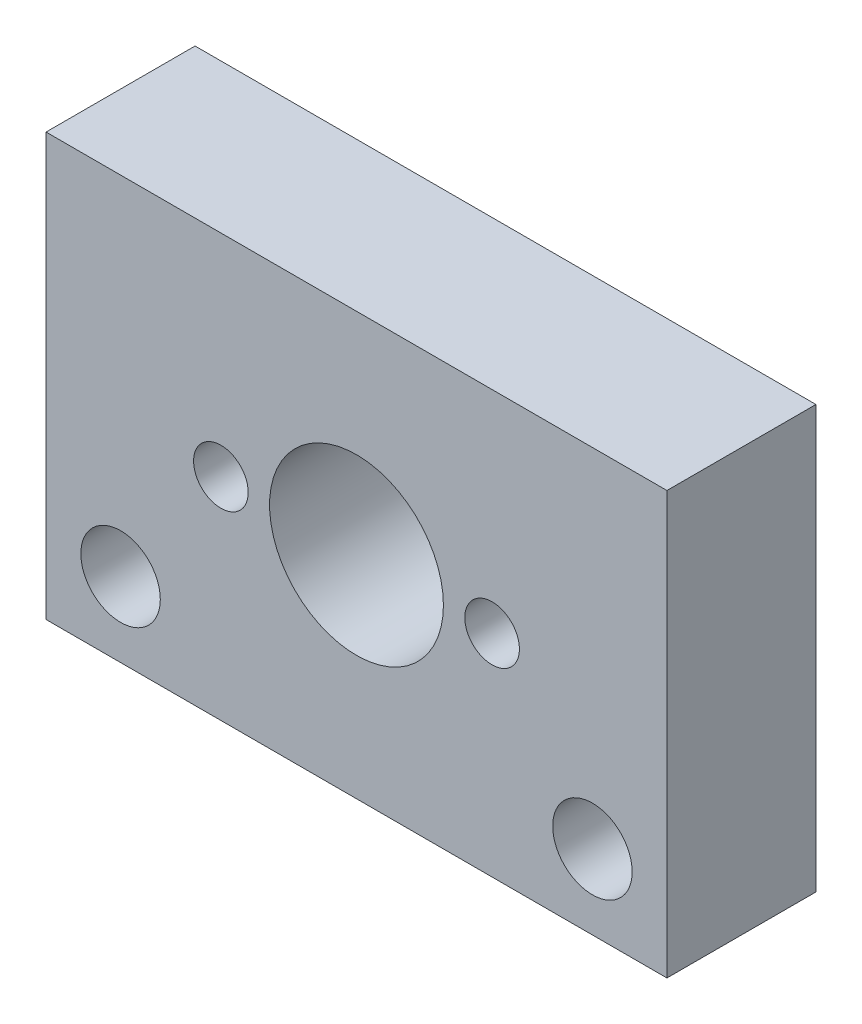
ISO-10303-21;
HEADER;
FILE_DESCRIPTION(('STEP AP214'),'2;1');
FILE_NAME('part.step','',(''),(''),'','','');
FILE_SCHEMA(('AUTOMOTIVE_DESIGN { 1 0 10303 214 1 1 1 1 }'));
ENDSEC;
DATA;
#1=APPLICATION_CONTEXT('core data for automotive mechanical design processes');
#2=APPLICATION_PROTOCOL_DEFINITION('international standard','automotive_design',2000,#1);
#3=PRODUCT_CONTEXT('',#1,'mechanical');
#4=PRODUCT('Part','Part','',(#3));
#5=PRODUCT_RELATED_PRODUCT_CATEGORY('part','',(#4));
#6=PRODUCT_DEFINITION_FORMATION('','',#4);
#7=PRODUCT_DEFINITION_CONTEXT('part definition',#1,'design');
#8=PRODUCT_DEFINITION('design','',#6,#7);
#9=PRODUCT_DEFINITION_SHAPE('','',#8);
#10=(LENGTH_UNIT() NAMED_UNIT(*) SI_UNIT(.MILLI.,.METRE.));
#11=(NAMED_UNIT(*) PLANE_ANGLE_UNIT() SI_UNIT($,.RADIAN.));
#12=(NAMED_UNIT(*) SI_UNIT($,.STERADIAN.) SOLID_ANGLE_UNIT());
#13=UNCERTAINTY_MEASURE_WITH_UNIT(LENGTH_MEASURE(1.E-05),#10,'distance_accuracy_value','');
#14=(GEOMETRIC_REPRESENTATION_CONTEXT(3) GLOBAL_UNCERTAINTY_ASSIGNED_CONTEXT((#13)) GLOBAL_UNIT_ASSIGNED_CONTEXT((#10,
#11,#12)) REPRESENTATION_CONTEXT('',''));
#15=CARTESIAN_POINT('',(0.,0.,0.));
#16=DIRECTION('',(0.,0.,1.));
#17=DIRECTION('',(1.,0.,0.));
#18=AXIS2_PLACEMENT_3D('',#15,#16,#17);
#19=CARTESIAN_POINT('',(12.5,8.5,6.));
#20=DIRECTION('',(-1.,0.,0.));
#21=DIRECTION('',(0.,-1.,0.));
#22=AXIS2_PLACEMENT_3D('',#19,#20,#21);
#23=PLANE('',#22);
#24=DIRECTION('',(0.,1.,0.));
#25=VECTOR('',#24,1.);
#26=CARTESIAN_POINT('',(12.5,8.5,0.));
#27=LINE('',#26,#25);
#28=CARTESIAN_POINT('',(12.5,-8.5,0.));
#29=VERTEX_POINT('',#28);
#30=CARTESIAN_POINT('',(12.5,8.5,0.));
#31=VERTEX_POINT('',#30);
#32=EDGE_CURVE('E95',#29,#31,#27,.T.);
#33=ORIENTED_EDGE('',*,*,#32,.T.);
#34=DIRECTION('',(0.,0.,-1.));
#35=VECTOR('',#34,1.);
#36=CARTESIAN_POINT('',(12.5,8.5,6.));
#37=LINE('',#36,#35);
#38=CARTESIAN_POINT('',(12.5,8.5,6.));
#39=VERTEX_POINT('',#38);
#40=EDGE_CURVE('E11',#39,#31,#37,.T.);
#41=ORIENTED_EDGE('',*,*,#40,.F.);
#42=DIRECTION('',(0.,1.,0.));
#43=VECTOR('',#42,1.);
#44=CARTESIAN_POINT('',(12.5,8.5,6.));
#45=LINE('',#44,#43);
#46=CARTESIAN_POINT('',(12.5,-8.5,6.));
#47=VERTEX_POINT('',#46);
#48=EDGE_CURVE('E83',#47,#39,#45,.T.);
#49=ORIENTED_EDGE('',*,*,#48,.F.);
#50=DIRECTION('',(0.,0.,-1.));
#51=VECTOR('',#50,1.);
#52=CARTESIAN_POINT('',(12.5,-8.5,6.));
#53=LINE('',#52,#51);
#54=EDGE_CURVE('E91',#47,#29,#53,.T.);
#55=ORIENTED_EDGE('',*,*,#54,.T.);
#56=EDGE_LOOP('',(#33,#41,#49,#55));
#57=FACE_BOUND('',#56,.T.);
#58=ADVANCED_FACE('F32',(#57),#23,.F.);
#59=CARTESIAN_POINT('',(-12.5,8.5,6.));
#60=DIRECTION('',(0.,-1.,0.));
#61=DIRECTION('',(0.,0.,-1.));
#62=AXIS2_PLACEMENT_3D('',#59,#60,#61);
#63=PLANE('',#62);
#64=DIRECTION('',(-1.,0.,0.));
#65=VECTOR('',#64,1.);
#66=CARTESIAN_POINT('',(-12.5,8.5,0.));
#67=LINE('',#66,#65);
#68=CARTESIAN_POINT('',(-12.5,8.5,0.));
#69=VERTEX_POINT('',#68);
#70=EDGE_CURVE('E87',#31,#69,#67,.T.);
#71=ORIENTED_EDGE('',*,*,#70,.T.);
#72=DIRECTION('',(0.,0.,-1.));
#73=VECTOR('',#72,1.);
#74=CARTESIAN_POINT('',(-12.5,8.5,6.));
#75=LINE('',#74,#73);
#76=CARTESIAN_POINT('',(-12.5,8.5,6.));
#77=VERTEX_POINT('',#76);
#78=EDGE_CURVE('E40',#77,#69,#75,.T.);
#79=ORIENTED_EDGE('',*,*,#78,.F.);
#80=DIRECTION('',(-1.,0.,0.));
#81=VECTOR('',#80,1.);
#82=CARTESIAN_POINT('',(-12.5,8.5,6.));
#83=LINE('',#82,#81);
#84=EDGE_CURVE('E78',#39,#77,#83,.T.);
#85=ORIENTED_EDGE('',*,*,#84,.F.);
#86=ORIENTED_EDGE('',*,*,#40,.T.);
#87=EDGE_LOOP('',(#71,#79,#85,#86));
#88=FACE_BOUND('',#87,.T.);
#89=ADVANCED_FACE('F86',(#88),#63,.F.);
#90=CARTESIAN_POINT('',(-12.5,8.5,6.));
#91=DIRECTION('',(1.,0.,0.));
#92=DIRECTION('',(0.,1.,0.));
#93=AXIS2_PLACEMENT_3D('',#90,#91,#92);
#94=PLANE('',#93);
#95=DIRECTION('',(0.,-1.,0.));
#96=VECTOR('',#95,1.);
#97=CARTESIAN_POINT('',(-12.5,8.5,0.));
#98=LINE('',#97,#96);
#99=CARTESIAN_POINT('',(-12.5,-8.5,0.));
#100=VERTEX_POINT('',#99);
#101=EDGE_CURVE('E65',#69,#100,#98,.T.);
#102=ORIENTED_EDGE('',*,*,#101,.T.);
#103=DIRECTION('',(0.,0.,-1.));
#104=VECTOR('',#103,1.);
#105=CARTESIAN_POINT('',(-12.5,-8.5,6.));
#106=LINE('',#105,#104);
#107=CARTESIAN_POINT('',(-12.5,-8.5,6.));
#108=VERTEX_POINT('',#107);
#109=EDGE_CURVE('E88',#108,#100,#106,.T.);
#110=ORIENTED_EDGE('',*,*,#109,.F.);
#111=DIRECTION('',(0.,-1.,0.));
#112=VECTOR('',#111,1.);
#113=CARTESIAN_POINT('',(-12.5,8.5,6.));
#114=LINE('',#113,#112);
#115=EDGE_CURVE('E81',#77,#108,#114,.T.);
#116=ORIENTED_EDGE('',*,*,#115,.F.);
#117=ORIENTED_EDGE('',*,*,#78,.T.);
#118=EDGE_LOOP('',(#102,#110,#116,#117));
#119=FACE_BOUND('',#118,.T.);
#120=ADVANCED_FACE('F89',(#119),#94,.F.);
#121=CARTESIAN_POINT('',(-12.5,-8.5,6.));
#122=DIRECTION('',(0.,1.,0.));
#123=DIRECTION('',(0.,0.,1.));
#124=AXIS2_PLACEMENT_3D('',#121,#122,#123);
#125=PLANE('',#124);
#126=DIRECTION('',(1.,0.,0.));
#127=VECTOR('',#126,1.);
#128=CARTESIAN_POINT('',(-12.5,-8.5,0.));
#129=LINE('',#128,#127);
#130=EDGE_CURVE('E71',#100,#29,#129,.T.);
#131=ORIENTED_EDGE('',*,*,#130,.T.);
#132=ORIENTED_EDGE('',*,*,#54,.F.);
#133=DIRECTION('',(1.,0.,0.));
#134=VECTOR('',#133,1.);
#135=CARTESIAN_POINT('',(-12.5,-8.5,6.));
#136=LINE('',#135,#134);
#137=EDGE_CURVE('E48',#108,#47,#136,.T.);
#138=ORIENTED_EDGE('',*,*,#137,.F.);
#139=ORIENTED_EDGE('',*,*,#109,.T.);
#140=EDGE_LOOP('',(#131,#132,#138,#139));
#141=FACE_BOUND('',#140,.T.);
#142=ADVANCED_FACE('F103',(#141),#125,.F.);
#143=CARTESIAN_POINT('',(0.,0.,6.));
#144=DIRECTION('',(0.,0.,1.));
#145=DIRECTION('',(1.,0.,0.));
#146=AXIS2_PLACEMENT_3D('',#143,#144,#145);
#147=PLANE('',#146);
#148=CARTESIAN_POINT('',(-5.46,0.,6.));
#149=DIRECTION('',(0.,0.,1.));
#150=DIRECTION('',(1.,0.,0.));
#151=AXIS2_PLACEMENT_3D('',#148,#149,#150);
#152=CIRCLE('',#151,1.1);
#153=CARTESIAN_POINT('',(-4.36,0.,6.));
#154=VERTEX_POINT('',#153);
#155=EDGE_CURVE('E135',#154,#154,#152,.T.);
#156=ORIENTED_EDGE('',*,*,#155,.F.);
#157=EDGE_LOOP('',(#156));
#158=FACE_BOUND('',#157,.T.);
#159=CARTESIAN_POINT('',(5.46,0.,6.));
#160=DIRECTION('',(0.,0.,1.));
#161=DIRECTION('',(1.,0.,0.));
#162=AXIS2_PLACEMENT_3D('',#159,#160,#161);
#163=CIRCLE('',#162,1.1);
#164=CARTESIAN_POINT('',(6.56,0.,6.));
#165=VERTEX_POINT('',#164);
#166=EDGE_CURVE('E129',#165,#165,#163,.T.);
#167=ORIENTED_EDGE('',*,*,#166,.F.);
#168=EDGE_LOOP('',(#167));
#169=FACE_BOUND('',#168,.T.);
#170=CARTESIAN_POINT('',(0.,0.,6.));
#171=DIRECTION('',(0.,0.,1.));
#172=DIRECTION('',(1.,0.,0.));
#173=AXIS2_PLACEMENT_3D('',#170,#171,#172);
#174=CIRCLE('',#173,3.5);
#175=CARTESIAN_POINT('',(3.5,0.,6.));
#176=VERTEX_POINT('',#175);
#177=EDGE_CURVE('E123',#176,#176,#174,.T.);
#178=ORIENTED_EDGE('',*,*,#177,.F.);
#179=EDGE_LOOP('',(#178));
#180=FACE_BOUND('',#179,.T.);
#181=CARTESIAN_POINT('',(-9.5,-5.5,6.));
#182=DIRECTION('',(0.,0.,1.));
#183=DIRECTION('',(1.,0.,0.));
#184=AXIS2_PLACEMENT_3D('',#181,#182,#183);
#185=CIRCLE('',#184,1.6);
#186=CARTESIAN_POINT('',(-7.9,-5.5,6.));
#187=VERTEX_POINT('',#186);
#188=EDGE_CURVE('E117',#187,#187,#185,.T.);
#189=ORIENTED_EDGE('',*,*,#188,.F.);
#190=EDGE_LOOP('',(#189));
#191=FACE_BOUND('',#190,.T.);
#192=CARTESIAN_POINT('',(9.5,-5.5,6.));
#193=DIRECTION('',(0.,0.,1.));
#194=DIRECTION('',(1.,0.,0.));
#195=AXIS2_PLACEMENT_3D('',#192,#193,#194);
#196=CIRCLE('',#195,1.6);
#197=CARTESIAN_POINT('',(11.1,-5.5,6.));
#198=VERTEX_POINT('',#197);
#199=EDGE_CURVE('E111',#198,#198,#196,.T.);
#200=ORIENTED_EDGE('',*,*,#199,.F.);
#201=EDGE_LOOP('',(#200));
#202=FACE_BOUND('',#201,.T.);
#203=ORIENTED_EDGE('',*,*,#48,.T.);
#204=ORIENTED_EDGE('',*,*,#84,.T.);
#205=ORIENTED_EDGE('',*,*,#115,.T.);
#206=ORIENTED_EDGE('',*,*,#137,.T.);
#207=EDGE_LOOP('',(#203,#204,#205,#206));
#208=FACE_BOUND('',#207,.T.);
#209=ADVANCED_FACE('F79',(#158,#169,#180,#191,#202,#208),#147,.T.);
#210=CARTESIAN_POINT('',(0.,0.,0.));
#211=DIRECTION('',(0.,0.,1.));
#212=DIRECTION('',(1.,0.,0.));
#213=AXIS2_PLACEMENT_3D('',#210,#211,#212);
#214=PLANE('',#213);
#215=CARTESIAN_POINT('',(-5.46,0.,0.));
#216=DIRECTION('',(0.,0.,1.));
#217=DIRECTION('',(1.,0.,0.));
#218=AXIS2_PLACEMENT_3D('',#215,#216,#217);
#219=CIRCLE('',#218,1.1);
#220=CARTESIAN_POINT('',(-4.36,0.,0.));
#221=VERTEX_POINT('',#220);
#222=EDGE_CURVE('E132',#221,#221,#219,.T.);
#223=ORIENTED_EDGE('',*,*,#222,.T.);
#224=EDGE_LOOP('',(#223));
#225=FACE_BOUND('',#224,.T.);
#226=CARTESIAN_POINT('',(5.46,0.,0.));
#227=DIRECTION('',(0.,0.,1.));
#228=DIRECTION('',(1.,0.,0.));
#229=AXIS2_PLACEMENT_3D('',#226,#227,#228);
#230=CIRCLE('',#229,1.1);
#231=CARTESIAN_POINT('',(6.56,0.,0.));
#232=VERTEX_POINT('',#231);
#233=EDGE_CURVE('E126',#232,#232,#230,.T.);
#234=ORIENTED_EDGE('',*,*,#233,.T.);
#235=EDGE_LOOP('',(#234));
#236=FACE_BOUND('',#235,.T.);
#237=CARTESIAN_POINT('',(0.,0.,0.));
#238=DIRECTION('',(0.,0.,1.));
#239=DIRECTION('',(1.,0.,0.));
#240=AXIS2_PLACEMENT_3D('',#237,#238,#239);
#241=CIRCLE('',#240,3.5);
#242=CARTESIAN_POINT('',(3.5,0.,0.));
#243=VERTEX_POINT('',#242);
#244=EDGE_CURVE('E120',#243,#243,#241,.T.);
#245=ORIENTED_EDGE('',*,*,#244,.T.);
#246=EDGE_LOOP('',(#245));
#247=FACE_BOUND('',#246,.T.);
#248=CARTESIAN_POINT('',(-9.5,-5.5,0.));
#249=DIRECTION('',(0.,0.,1.));
#250=DIRECTION('',(1.,0.,0.));
#251=AXIS2_PLACEMENT_3D('',#248,#249,#250);
#252=CIRCLE('',#251,1.6);
#253=CARTESIAN_POINT('',(-7.9,-5.5,0.));
#254=VERTEX_POINT('',#253);
#255=EDGE_CURVE('E114',#254,#254,#252,.T.);
#256=ORIENTED_EDGE('',*,*,#255,.T.);
#257=EDGE_LOOP('',(#256));
#258=FACE_BOUND('',#257,.T.);
#259=CARTESIAN_POINT('',(9.5,-5.5,0.));
#260=DIRECTION('',(0.,0.,1.));
#261=DIRECTION('',(1.,0.,0.));
#262=AXIS2_PLACEMENT_3D('',#259,#260,#261);
#263=CIRCLE('',#262,1.6);
#264=CARTESIAN_POINT('',(11.1,-5.5,0.));
#265=VERTEX_POINT('',#264);
#266=EDGE_CURVE('E98',#265,#265,#263,.T.);
#267=ORIENTED_EDGE('',*,*,#266,.T.);
#268=EDGE_LOOP('',(#267));
#269=FACE_BOUND('',#268,.T.);
#270=ORIENTED_EDGE('',*,*,#32,.F.);
#271=ORIENTED_EDGE('',*,*,#130,.F.);
#272=ORIENTED_EDGE('',*,*,#101,.F.);
#273=ORIENTED_EDGE('',*,*,#70,.F.);
#274=EDGE_LOOP('',(#270,#271,#272,#273));
#275=FACE_BOUND('',#274,.T.);
#276=ADVANCED_FACE('F106',(#225,#236,#247,#258,#269,#275),#214,.F.);
#277=CARTESIAN_POINT('',(9.5,-5.5,6.));
#278=DIRECTION('',(0.,0.,1.));
#279=DIRECTION('',(1.,0.,0.));
#280=AXIS2_PLACEMENT_3D('',#277,#278,#279);
#281=CYLINDRICAL_SURFACE('',#280,1.6);
#282=ORIENTED_EDGE('',*,*,#266,.F.);
#283=EDGE_LOOP('',(#282));
#284=FACE_BOUND('',#283,.T.);
#285=ORIENTED_EDGE('',*,*,#199,.T.);
#286=EDGE_LOOP('',(#285));
#287=FACE_BOUND('',#286,.T.);
#288=ADVANCED_FACE('F152',(#284,#287),#281,.F.);
#289=CARTESIAN_POINT('',(-9.5,-5.5,6.));
#290=DIRECTION('',(0.,0.,1.));
#291=DIRECTION('',(1.,0.,0.));
#292=AXIS2_PLACEMENT_3D('',#289,#290,#291);
#293=CYLINDRICAL_SURFACE('',#292,1.6);
#294=ORIENTED_EDGE('',*,*,#255,.F.);
#295=EDGE_LOOP('',(#294));
#296=FACE_BOUND('',#295,.T.);
#297=ORIENTED_EDGE('',*,*,#188,.T.);
#298=EDGE_LOOP('',(#297));
#299=FACE_BOUND('',#298,.T.);
#300=ADVANCED_FACE('F154',(#296,#299),#293,.F.);
#301=CARTESIAN_POINT('',(0.,0.,6.));
#302=DIRECTION('',(0.,0.,1.));
#303=DIRECTION('',(1.,0.,0.));
#304=AXIS2_PLACEMENT_3D('',#301,#302,#303);
#305=CYLINDRICAL_SURFACE('',#304,3.5);
#306=ORIENTED_EDGE('',*,*,#244,.F.);
#307=EDGE_LOOP('',(#306));
#308=FACE_BOUND('',#307,.T.);
#309=ORIENTED_EDGE('',*,*,#177,.T.);
#310=EDGE_LOOP('',(#309));
#311=FACE_BOUND('',#310,.T.);
#312=ADVANCED_FACE('F161',(#308,#311),#305,.F.);
#313=CARTESIAN_POINT('',(5.46,0.,6.));
#314=DIRECTION('',(0.,0.,1.));
#315=DIRECTION('',(1.,0.,0.));
#316=AXIS2_PLACEMENT_3D('',#313,#314,#315);
#317=CYLINDRICAL_SURFACE('',#316,1.1);
#318=ORIENTED_EDGE('',*,*,#233,.F.);
#319=EDGE_LOOP('',(#318));
#320=FACE_BOUND('',#319,.T.);
#321=ORIENTED_EDGE('',*,*,#166,.T.);
#322=EDGE_LOOP('',(#321));
#323=FACE_BOUND('',#322,.T.);
#324=ADVANCED_FACE('F196',(#320,#323),#317,.F.);
#325=CARTESIAN_POINT('',(-5.46,0.,6.));
#326=DIRECTION('',(0.,0.,1.));
#327=DIRECTION('',(1.,0.,0.));
#328=AXIS2_PLACEMENT_3D('',#325,#326,#327);
#329=CYLINDRICAL_SURFACE('',#328,1.1);
#330=ORIENTED_EDGE('',*,*,#222,.F.);
#331=EDGE_LOOP('',(#330));
#332=FACE_BOUND('',#331,.T.);
#333=ORIENTED_EDGE('',*,*,#155,.T.);
#334=EDGE_LOOP('',(#333));
#335=FACE_BOUND('',#334,.T.);
#336=ADVANCED_FACE('F139',(#332,#335),#329,.F.);
#337=CLOSED_SHELL('',(#58,#89,#120,#142,#209,#276,#288,#300,#312,#324,#336));
#338=MANIFOLD_SOLID_BREP('B2',#337);
#339=ADVANCED_BREP_SHAPE_REPRESENTATION('',(#18,#338),#14);
#340=SHAPE_DEFINITION_REPRESENTATION(#9,#339);
ENDSEC;
END-ISO-10303-21;
